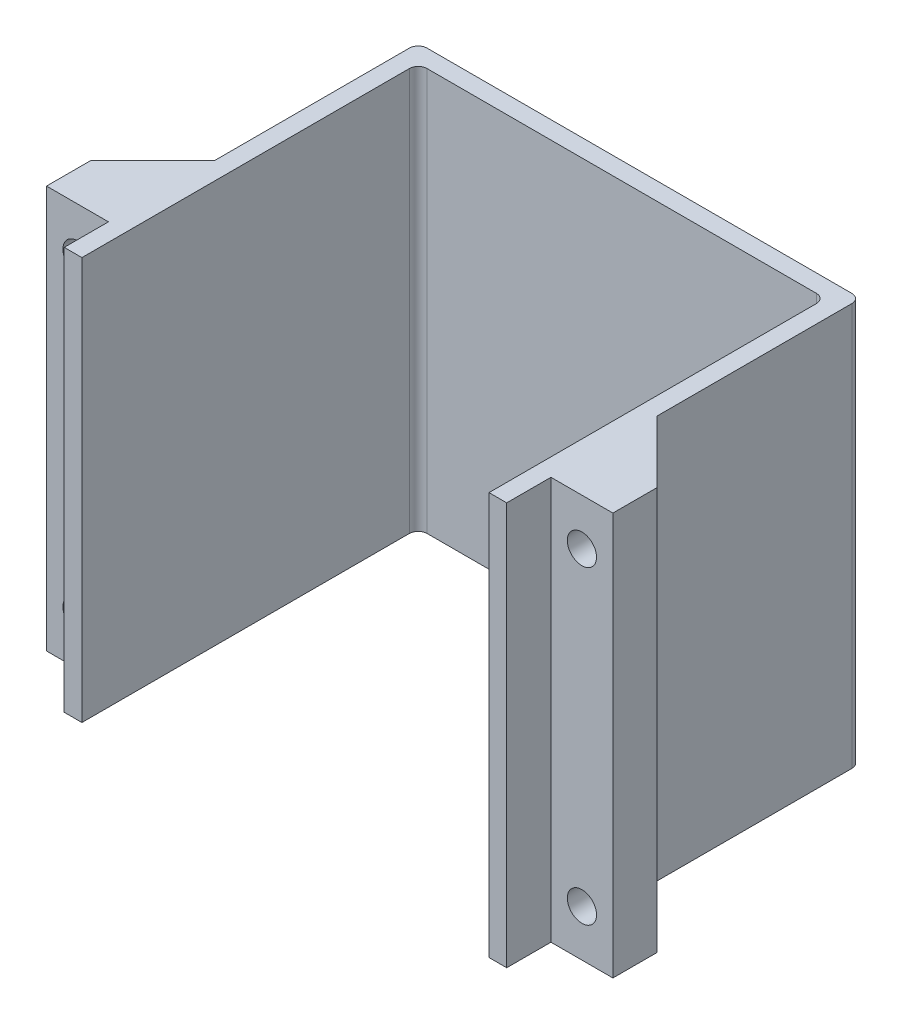
ISO-10303-21;
HEADER;
FILE_DESCRIPTION(('STEP AP214'),'2;1');
FILE_NAME('part.step','',(''),(''),'','','');
FILE_SCHEMA(('AUTOMOTIVE_DESIGN { 1 0 10303 214 1 1 1 1 }'));
ENDSEC;
DATA;
#1=APPLICATION_CONTEXT('core data for automotive mechanical design processes');
#2=APPLICATION_PROTOCOL_DEFINITION('international standard','automotive_design',2000,#1);
#3=PRODUCT_CONTEXT('',#1,'mechanical');
#4=PRODUCT('Part','Part','',(#3));
#5=PRODUCT_RELATED_PRODUCT_CATEGORY('part','',(#4));
#6=PRODUCT_DEFINITION_FORMATION('','',#4);
#7=PRODUCT_DEFINITION_CONTEXT('part definition',#1,'design');
#8=PRODUCT_DEFINITION('design','',#6,#7);
#9=PRODUCT_DEFINITION_SHAPE('','',#8);
#10=(LENGTH_UNIT() NAMED_UNIT(*) SI_UNIT(.MILLI.,.METRE.));
#11=(NAMED_UNIT(*) PLANE_ANGLE_UNIT() SI_UNIT($,.RADIAN.));
#12=(NAMED_UNIT(*) SI_UNIT($,.STERADIAN.) SOLID_ANGLE_UNIT());
#13=UNCERTAINTY_MEASURE_WITH_UNIT(LENGTH_MEASURE(1.E-05),#10,'distance_accuracy_value','');
#14=(GEOMETRIC_REPRESENTATION_CONTEXT(3) GLOBAL_UNCERTAINTY_ASSIGNED_CONTEXT((#13)) GLOBAL_UNIT_ASSIGNED_CONTEXT((#10,
#11,#12)) REPRESENTATION_CONTEXT('',''));
#15=CARTESIAN_POINT('',(0.,0.,0.));
#16=DIRECTION('',(0.,0.,1.));
#17=DIRECTION('',(1.,0.,0.));
#18=AXIS2_PLACEMENT_3D('',#15,#16,#17);
#19=CARTESIAN_POINT('',(28.5,5.25,-20.001));
#20=DIRECTION('',(0.,0.,1.));
#21=DIRECTION('',(1.,0.,0.));
#22=AXIS2_PLACEMENT_3D('',#19,#20,#21);
#23=CYLINDRICAL_SURFACE('',#22,1.65);
#24=CARTESIAN_POINT('',(28.5,5.25,10.));
#25=DIRECTION('',(0.,0.,-1.));
#26=DIRECTION('',(-1.,0.,0.));
#27=AXIS2_PLACEMENT_3D('',#24,#25,#26);
#28=CIRCLE('',#27,1.65);
#29=CARTESIAN_POINT('',(26.85,5.25,10.));
#30=VERTEX_POINT('',#29);
#31=EDGE_CURVE('E247',#30,#30,#28,.F.);
#32=ORIENTED_EDGE('',*,*,#31,.F.);
#33=EDGE_LOOP('',(#32));
#34=FACE_BOUND('',#33,.T.);
#35=CARTESIAN_POINT('',(28.5,5.25,15.));
#36=DIRECTION('',(0.,0.,1.));
#37=DIRECTION('',(1.,0.,0.));
#38=AXIS2_PLACEMENT_3D('',#35,#36,#37);
#39=CIRCLE('',#38,1.65);
#40=CARTESIAN_POINT('',(30.15,5.25,15.));
#41=VERTEX_POINT('',#40);
#42=EDGE_CURVE('E739',#41,#41,#39,.F.);
#43=ORIENTED_EDGE('',*,*,#42,.F.);
#44=EDGE_LOOP('',(#43));
#45=FACE_BOUND('',#44,.T.);
#46=ADVANCED_FACE('F37',(#34,#45),#23,.F.);
#47=CARTESIAN_POINT('',(28.5,40.25,-20.001));
#48=DIRECTION('',(0.,0.,1.));
#49=DIRECTION('',(1.,0.,0.));
#50=AXIS2_PLACEMENT_3D('',#47,#48,#49);
#51=CYLINDRICAL_SURFACE('',#50,1.65);
#52=CARTESIAN_POINT('',(28.5,40.25,10.));
#53=DIRECTION('',(0.,0.,-1.));
#54=DIRECTION('',(-1.,0.,0.));
#55=AXIS2_PLACEMENT_3D('',#52,#53,#54);
#56=CIRCLE('',#55,1.65);
#57=CARTESIAN_POINT('',(26.85,40.25,10.));
#58=VERTEX_POINT('',#57);
#59=EDGE_CURVE('E244',#58,#58,#56,.F.);
#60=ORIENTED_EDGE('',*,*,#59,.F.);
#61=EDGE_LOOP('',(#60));
#62=FACE_BOUND('',#61,.T.);
#63=CARTESIAN_POINT('',(28.5,40.25,15.));
#64=DIRECTION('',(0.,0.,1.));
#65=DIRECTION('',(1.,0.,0.));
#66=AXIS2_PLACEMENT_3D('',#63,#64,#65);
#67=CIRCLE('',#66,1.65);
#68=CARTESIAN_POINT('',(30.15,40.25,15.));
#69=VERTEX_POINT('',#68);
#70=EDGE_CURVE('E736',#69,#69,#67,.F.);
#71=ORIENTED_EDGE('',*,*,#70,.F.);
#72=EDGE_LOOP('',(#71));
#73=FACE_BOUND('',#72,.T.);
#74=ADVANCED_FACE('F429',(#62,#73),#51,.F.);
#75=CARTESIAN_POINT('',(32.,45.5,-20.));
#76=DIRECTION('',(-1.,0.,0.));
#77=DIRECTION('',(0.,0.,1.));
#78=AXIS2_PLACEMENT_3D('',#75,#76,#77);
#79=PLANE('',#78);
#80=DIRECTION('',(0.,-1.,0.));
#81=VECTOR('',#80,1.);
#82=CARTESIAN_POINT('',(32.,45.5,15.));
#83=LINE('',#82,#81);
#84=CARTESIAN_POINT('',(32.,45.5,15.));
#85=VERTEX_POINT('',#84);
#86=CARTESIAN_POINT('',(32.,0.,15.));
#87=VERTEX_POINT('',#86);
#88=EDGE_CURVE('E175',#85,#87,#83,.T.);
#89=ORIENTED_EDGE('',*,*,#88,.T.);
#90=DIRECTION('',(0.,0.,-1.));
#91=VECTOR('',#90,1.);
#92=CARTESIAN_POINT('',(32.,0.,-20.));
#93=LINE('',#92,#91);
#94=CARTESIAN_POINT('',(32.,0.,10.));
#95=VERTEX_POINT('',#94);
#96=EDGE_CURVE('E221',#87,#95,#93,.T.);
#97=ORIENTED_EDGE('',*,*,#96,.T.);
#98=DIRECTION('',(0.,1.,0.));
#99=VECTOR('',#98,1.);
#100=CARTESIAN_POINT('',(32.,-0.001000000000001,10.));
#101=LINE('',#100,#99);
#102=CARTESIAN_POINT('',(32.,45.5,10.));
#103=VERTEX_POINT('',#102);
#104=EDGE_CURVE('E201',#95,#103,#101,.T.);
#105=ORIENTED_EDGE('',*,*,#104,.T.);
#106=DIRECTION('',(0.,0.,-1.));
#107=VECTOR('',#106,1.);
#108=CARTESIAN_POINT('',(32.,45.5,-20.));
#109=LINE('',#108,#107);
#110=EDGE_CURVE('E193',#85,#103,#109,.T.);
#111=ORIENTED_EDGE('',*,*,#110,.F.);
#112=EDGE_LOOP('',(#89,#97,#105,#111));
#113=FACE_BOUND('',#112,.T.);
#114=ADVANCED_FACE('F199',(#113),#79,.F.);
#115=CARTESIAN_POINT('',(0.,45.5,0.));
#116=DIRECTION('',(0.,1.,0.));
#117=DIRECTION('',(0.,0.,1.));
#118=AXIS2_PLACEMENT_3D('',#115,#116,#117);
#119=PLANE('',#118);
#120=DIRECTION('',(-1.,0.,0.));
#121=VECTOR('',#120,1.);
#122=CARTESIAN_POINT('',(-32.,45.5,-20.));
#123=LINE('',#122,#121);
#124=CARTESIAN_POINT('',(24.,45.5,-20.));
#125=VERTEX_POINT('',#124);
#126=CARTESIAN_POINT('',(-24.,45.5,-20.));
#127=VERTEX_POINT('',#126);
#128=EDGE_CURVE('E203',#125,#127,#123,.T.);
#129=ORIENTED_EDGE('',*,*,#128,.T.);
#130=CARTESIAN_POINT('',(-24.,45.5,-19.));
#131=DIRECTION('',(0.,1.,0.));
#132=DIRECTION('',(0.,0.,1.));
#133=AXIS2_PLACEMENT_3D('',#130,#131,#132);
#134=CIRCLE('',#133,1.);
#135=CARTESIAN_POINT('',(-25.,45.5,-19.));
#136=VERTEX_POINT('',#135);
#137=EDGE_CURVE('E264',#127,#136,#134,.T.);
#138=ORIENTED_EDGE('',*,*,#137,.T.);
#139=DIRECTION('',(0.,0.,-1.));
#140=VECTOR('',#139,1.);
#141=CARTESIAN_POINT('',(-25.,45.5,-20.));
#142=LINE('',#141,#140);
#143=CARTESIAN_POINT('',(-25.,45.5,3.00000000000006));
#144=VERTEX_POINT('',#143);
#145=EDGE_CURVE('E368',#144,#136,#142,.T.);
#146=ORIENTED_EDGE('',*,*,#145,.F.);
#147=DIRECTION('',(-0.707106781186551,0.,0.707106781186544));
#148=VECTOR('',#147,1.);
#149=CARTESIAN_POINT('',(-25.,45.5,3.00000000000006));
#150=LINE('',#149,#148);
#151=CARTESIAN_POINT('',(-32.,45.5,10.));
#152=VERTEX_POINT('',#151);
#153=EDGE_CURVE('E361',#144,#152,#150,.T.);
#154=ORIENTED_EDGE('',*,*,#153,.T.);
#155=DIRECTION('',(0.,0.,1.));
#156=VECTOR('',#155,1.);
#157=CARTESIAN_POINT('',(-32.,45.5,-20.));
#158=LINE('',#157,#156);
#159=CARTESIAN_POINT('',(-32.,45.5,15.));
#160=VERTEX_POINT('',#159);
#161=EDGE_CURVE('E206',#152,#160,#158,.T.);
#162=ORIENTED_EDGE('',*,*,#161,.T.);
#163=DIRECTION('',(-1.,0.,0.));
#164=VECTOR('',#163,1.);
#165=CARTESIAN_POINT('',(-32.,45.5,15.));
#166=LINE('',#165,#164);
#167=CARTESIAN_POINT('',(-25.,45.5,15.));
#168=VERTEX_POINT('',#167);
#169=EDGE_CURVE('E339',#168,#160,#166,.T.);
#170=ORIENTED_EDGE('',*,*,#169,.F.);
#171=DIRECTION('',(0.,0.,1.));
#172=VECTOR('',#171,1.);
#173=CARTESIAN_POINT('',(-25.,45.5,15.));
#174=LINE('',#173,#172);
#175=CARTESIAN_POINT('',(-25.,45.5,20.));
#176=VERTEX_POINT('',#175);
#177=EDGE_CURVE('E338',#168,#176,#174,.T.);
#178=ORIENTED_EDGE('',*,*,#177,.T.);
#179=DIRECTION('',(1.,0.,0.));
#180=VECTOR('',#179,1.);
#181=CARTESIAN_POINT('',(-32.,45.5,20.));
#182=LINE('',#181,#180);
#183=CARTESIAN_POINT('',(-23.,45.5,20.));
#184=VERTEX_POINT('',#183);
#185=EDGE_CURVE('E217',#176,#184,#182,.T.);
#186=ORIENTED_EDGE('',*,*,#185,.T.);
#187=DIRECTION('',(0.,0.,1.));
#188=VECTOR('',#187,1.);
#189=CARTESIAN_POINT('',(-23.,45.5,-18.));
#190=LINE('',#189,#188);
#191=CARTESIAN_POINT('',(-23.,45.5,-17.));
#192=VERTEX_POINT('',#191);
#193=EDGE_CURVE('E300',#192,#184,#190,.T.);
#194=ORIENTED_EDGE('',*,*,#193,.F.);
#195=CARTESIAN_POINT('',(-22.,45.5,-17.));
#196=DIRECTION('',(0.,1.,0.));
#197=DIRECTION('',(0.,0.,1.));
#198=AXIS2_PLACEMENT_3D('',#195,#196,#197);
#199=CIRCLE('',#198,1.);
#200=CARTESIAN_POINT('',(-22.,45.5,-18.));
#201=VERTEX_POINT('',#200);
#202=EDGE_CURVE('E284',#192,#201,#199,.F.);
#203=ORIENTED_EDGE('',*,*,#202,.T.);
#204=DIRECTION('',(-1.,0.,0.));
#205=VECTOR('',#204,1.);
#206=CARTESIAN_POINT('',(23.,45.5,-18.));
#207=LINE('',#206,#205);
#208=CARTESIAN_POINT('',(22.,45.5,-18.));
#209=VERTEX_POINT('',#208);
#210=EDGE_CURVE('E292',#209,#201,#207,.T.);
#211=ORIENTED_EDGE('',*,*,#210,.F.);
#212=CARTESIAN_POINT('',(22.,45.5,-17.));
#213=DIRECTION('',(0.,1.,0.));
#214=DIRECTION('',(0.,0.,1.));
#215=AXIS2_PLACEMENT_3D('',#212,#213,#214);
#216=CIRCLE('',#215,1.);
#217=CARTESIAN_POINT('',(23.,45.5,-17.));
#218=VERTEX_POINT('',#217);
#219=EDGE_CURVE('E45',#209,#218,#216,.F.);
#220=ORIENTED_EDGE('',*,*,#219,.T.);
#221=DIRECTION('',(0.,0.,-1.));
#222=VECTOR('',#221,1.);
#223=CARTESIAN_POINT('',(23.,45.5,-18.));
#224=LINE('',#223,#222);
#225=CARTESIAN_POINT('',(23.,45.5,20.));
#226=VERTEX_POINT('',#225);
#227=EDGE_CURVE('E289',#226,#218,#224,.T.);
#228=ORIENTED_EDGE('',*,*,#227,.F.);
#229=CARTESIAN_POINT('',(25.,45.5,20.));
#230=VERTEX_POINT('',#229);
#231=EDGE_CURVE('E216',#226,#230,#182,.T.);
#232=ORIENTED_EDGE('',*,*,#231,.T.);
#233=DIRECTION('',(0.,0.,1.));
#234=VECTOR('',#233,1.);
#235=CARTESIAN_POINT('',(25.,45.5,15.));
#236=LINE('',#235,#234);
#237=CARTESIAN_POINT('',(25.,45.5,15.));
#238=VERTEX_POINT('',#237);
#239=EDGE_CURVE('E196',#238,#230,#236,.T.);
#240=ORIENTED_EDGE('',*,*,#239,.F.);
#241=DIRECTION('',(1.,0.,0.));
#242=VECTOR('',#241,1.);
#243=CARTESIAN_POINT('',(32.,45.5,15.));
#244=LINE('',#243,#242);
#245=EDGE_CURVE('E180',#238,#85,#244,.T.);
#246=ORIENTED_EDGE('',*,*,#245,.T.);
#247=ORIENTED_EDGE('',*,*,#110,.T.);
#248=DIRECTION('',(0.707106781186551,0.,0.707106781186544));
#249=VECTOR('',#248,1.);
#250=CARTESIAN_POINT('',(25.,45.5,3.00000000000006));
#251=LINE('',#250,#249);
#252=CARTESIAN_POINT('',(25.,45.5,3.00000000000006));
#253=VERTEX_POINT('',#252);
#254=EDGE_CURVE('E398',#253,#103,#251,.T.);
#255=ORIENTED_EDGE('',*,*,#254,.F.);
#256=DIRECTION('',(0.,0.,-1.));
#257=VECTOR('',#256,1.);
#258=CARTESIAN_POINT('',(25.,45.5,-20.));
#259=LINE('',#258,#257);
#260=CARTESIAN_POINT('',(25.,45.5,-19.));
#261=VERTEX_POINT('',#260);
#262=EDGE_CURVE('E396',#253,#261,#259,.T.);
#263=ORIENTED_EDGE('',*,*,#262,.T.);
#264=CARTESIAN_POINT('',(24.,45.5,-19.));
#265=DIRECTION('',(0.,1.,0.));
#266=DIRECTION('',(0.,0.,1.));
#267=AXIS2_PLACEMENT_3D('',#264,#265,#266);
#268=CIRCLE('',#267,1.);
#269=EDGE_CURVE('E262',#261,#125,#268,.T.);
#270=ORIENTED_EDGE('',*,*,#269,.T.);
#271=EDGE_LOOP('',(#129,#138,#146,#154,#162,#170,#178,#186,#194,#203,#211,#220,#228,#232,#240,
#246,#247,#255,#263,#270));
#272=FACE_BOUND('',#271,.T.);
#273=ADVANCED_FACE('F191',(#272),#119,.T.);
#274=CARTESIAN_POINT('',(0.,0.,0.));
#275=DIRECTION('',(0.,1.,0.));
#276=DIRECTION('',(0.,0.,1.));
#277=AXIS2_PLACEMENT_3D('',#274,#275,#276);
#278=PLANE('',#277);
#279=DIRECTION('',(0.,0.,1.));
#280=VECTOR('',#279,1.);
#281=CARTESIAN_POINT('',(-25.,0.,-20.));
#282=LINE('',#281,#280);
#283=CARTESIAN_POINT('',(-25.,0.,-19.));
#284=VERTEX_POINT('',#283);
#285=CARTESIAN_POINT('',(-25.,0.,3.00000000000006));
#286=VERTEX_POINT('',#285);
#287=EDGE_CURVE('E364',#284,#286,#282,.T.);
#288=ORIENTED_EDGE('',*,*,#287,.F.);
#289=CARTESIAN_POINT('',(-24.,0.,-19.));
#290=DIRECTION('',(0.,1.,0.));
#291=DIRECTION('',(0.,0.,1.));
#292=AXIS2_PLACEMENT_3D('',#289,#290,#291);
#293=CIRCLE('',#292,1.);
#294=CARTESIAN_POINT('',(-24.,0.,-20.));
#295=VERTEX_POINT('',#294);
#296=EDGE_CURVE('E269',#284,#295,#293,.F.);
#297=ORIENTED_EDGE('',*,*,#296,.T.);
#298=DIRECTION('',(-1.,0.,0.));
#299=VECTOR('',#298,1.);
#300=CARTESIAN_POINT('',(-32.,0.,-20.));
#301=LINE('',#300,#299);
#302=CARTESIAN_POINT('',(24.,0.,-20.));
#303=VERTEX_POINT('',#302);
#304=EDGE_CURVE('E223',#303,#295,#301,.T.);
#305=ORIENTED_EDGE('',*,*,#304,.F.);
#306=CARTESIAN_POINT('',(24.,0.,-19.));
#307=DIRECTION('',(0.,1.,0.));
#308=DIRECTION('',(0.,0.,1.));
#309=AXIS2_PLACEMENT_3D('',#306,#307,#308);
#310=CIRCLE('',#309,1.);
#311=CARTESIAN_POINT('',(25.,0.,-19.));
#312=VERTEX_POINT('',#311);
#313=EDGE_CURVE('E52',#303,#312,#310,.F.);
#314=ORIENTED_EDGE('',*,*,#313,.T.);
#315=DIRECTION('',(0.,0.,1.));
#316=VECTOR('',#315,1.);
#317=CARTESIAN_POINT('',(25.,0.,-20.));
#318=LINE('',#317,#316);
#319=CARTESIAN_POINT('',(25.,0.,3.00000000000006));
#320=VERTEX_POINT('',#319);
#321=EDGE_CURVE('E397',#312,#320,#318,.T.);
#322=ORIENTED_EDGE('',*,*,#321,.T.);
#323=DIRECTION('',(0.707106781186551,0.,0.707106781186544));
#324=VECTOR('',#323,1.);
#325=CARTESIAN_POINT('',(25.,0.,3.00000000000006));
#326=LINE('',#325,#324);
#327=EDGE_CURVE('E257',#320,#95,#326,.T.);
#328=ORIENTED_EDGE('',*,*,#327,.T.);
#329=ORIENTED_EDGE('',*,*,#96,.F.);
#330=DIRECTION('',(-1.,0.,0.));
#331=VECTOR('',#330,1.);
#332=CARTESIAN_POINT('',(32.,0.,15.));
#333=LINE('',#332,#331);
#334=CARTESIAN_POINT('',(25.,0.,15.));
#335=VERTEX_POINT('',#334);
#336=EDGE_CURVE('E183',#87,#335,#333,.T.);
#337=ORIENTED_EDGE('',*,*,#336,.T.);
#338=DIRECTION('',(0.,0.,1.));
#339=VECTOR('',#338,1.);
#340=CARTESIAN_POINT('',(25.,0.,15.));
#341=LINE('',#340,#339);
#342=CARTESIAN_POINT('',(25.,0.,20.));
#343=VERTEX_POINT('',#342);
#344=EDGE_CURVE('E733',#335,#343,#341,.T.);
#345=ORIENTED_EDGE('',*,*,#344,.T.);
#346=DIRECTION('',(1.,0.,0.));
#347=VECTOR('',#346,1.);
#348=CARTESIAN_POINT('',(-32.,0.,20.));
#349=LINE('',#348,#347);
#350=CARTESIAN_POINT('',(23.,0.,20.));
#351=VERTEX_POINT('',#350);
#352=EDGE_CURVE('E208',#351,#343,#349,.T.);
#353=ORIENTED_EDGE('',*,*,#352,.F.);
#354=DIRECTION('',(0.,0.,1.));
#355=VECTOR('',#354,1.);
#356=CARTESIAN_POINT('',(23.,0.,-18.));
#357=LINE('',#356,#355);
#358=CARTESIAN_POINT('',(23.,0.,-17.));
#359=VERTEX_POINT('',#358);
#360=EDGE_CURVE('E308',#359,#351,#357,.T.);
#361=ORIENTED_EDGE('',*,*,#360,.F.);
#362=CARTESIAN_POINT('',(22.,0.,-17.));
#363=DIRECTION('',(0.,1.,0.));
#364=DIRECTION('',(0.,0.,1.));
#365=AXIS2_PLACEMENT_3D('',#362,#363,#364);
#366=CIRCLE('',#365,1.);
#367=CARTESIAN_POINT('',(22.,0.,-18.));
#368=VERTEX_POINT('',#367);
#369=EDGE_CURVE('E12',#359,#368,#366,.T.);
#370=ORIENTED_EDGE('',*,*,#369,.T.);
#371=DIRECTION('',(1.,0.,0.));
#372=VECTOR('',#371,1.);
#373=CARTESIAN_POINT('',(23.,0.,-18.));
#374=LINE('',#373,#372);
#375=CARTESIAN_POINT('',(-22.,0.,-18.));
#376=VERTEX_POINT('',#375);
#377=EDGE_CURVE('E306',#376,#368,#374,.T.);
#378=ORIENTED_EDGE('',*,*,#377,.F.);
#379=CARTESIAN_POINT('',(-22.,0.,-17.));
#380=DIRECTION('',(0.,1.,0.));
#381=DIRECTION('',(0.,0.,1.));
#382=AXIS2_PLACEMENT_3D('',#379,#380,#381);
#383=CIRCLE('',#382,1.);
#384=CARTESIAN_POINT('',(-23.,0.,-17.));
#385=VERTEX_POINT('',#384);
#386=EDGE_CURVE('E59',#376,#385,#383,.T.);
#387=ORIENTED_EDGE('',*,*,#386,.T.);
#388=DIRECTION('',(0.,0.,-1.));
#389=VECTOR('',#388,1.);
#390=CARTESIAN_POINT('',(-23.,0.,-18.));
#391=LINE('',#390,#389);
#392=CARTESIAN_POINT('',(-23.,0.,20.));
#393=VERTEX_POINT('',#392);
#394=EDGE_CURVE('E312',#393,#385,#391,.T.);
#395=ORIENTED_EDGE('',*,*,#394,.F.);
#396=CARTESIAN_POINT('',(-25.,0.,20.));
#397=VERTEX_POINT('',#396);
#398=EDGE_CURVE('E204',#397,#393,#349,.T.);
#399=ORIENTED_EDGE('',*,*,#398,.F.);
#400=DIRECTION('',(0.,0.,1.));
#401=VECTOR('',#400,1.);
#402=CARTESIAN_POINT('',(-25.,0.,15.));
#403=LINE('',#402,#401);
#404=CARTESIAN_POINT('',(-25.,0.,15.));
#405=VERTEX_POINT('',#404);
#406=EDGE_CURVE('E333',#405,#397,#403,.T.);
#407=ORIENTED_EDGE('',*,*,#406,.F.);
#408=DIRECTION('',(1.,0.,0.));
#409=VECTOR('',#408,1.);
#410=CARTESIAN_POINT('',(-32.,0.,15.));
#411=LINE('',#410,#409);
#412=CARTESIAN_POINT('',(-32.,0.,15.));
#413=VERTEX_POINT('',#412);
#414=EDGE_CURVE('E336',#413,#405,#411,.T.);
#415=ORIENTED_EDGE('',*,*,#414,.F.);
#416=DIRECTION('',(0.,0.,1.));
#417=VECTOR('',#416,1.);
#418=CARTESIAN_POINT('',(-32.,0.,-20.));
#419=LINE('',#418,#417);
#420=CARTESIAN_POINT('',(-32.,0.,10.));
#421=VERTEX_POINT('',#420);
#422=EDGE_CURVE('E227',#421,#413,#419,.T.);
#423=ORIENTED_EDGE('',*,*,#422,.F.);
#424=DIRECTION('',(-0.707106781186551,0.,0.707106781186544));
#425=VECTOR('',#424,1.);
#426=CARTESIAN_POINT('',(-25.,0.,3.00000000000006));
#427=LINE('',#426,#425);
#428=EDGE_CURVE('E358',#286,#421,#427,.T.);
#429=ORIENTED_EDGE('',*,*,#428,.F.);
#430=EDGE_LOOP('',(#288,#297,#305,#314,#322,#328,#329,#337,#345,#353,#361,#370,#378,#387,#395,
#399,#407,#415,#423,#429));
#431=FACE_BOUND('',#430,.T.);
#432=ADVANCED_FACE('F305',(#431),#278,.F.);
#433=CARTESIAN_POINT('',(-32.,45.5,20.));
#434=DIRECTION('',(0.,0.,-1.));
#435=DIRECTION('',(-1.,0.,0.));
#436=AXIS2_PLACEMENT_3D('',#433,#434,#435);
#437=PLANE('',#436);
#438=DIRECTION('',(0.,1.,0.));
#439=VECTOR('',#438,1.);
#440=CARTESIAN_POINT('',(25.,45.5,20.));
#441=LINE('',#440,#439);
#442=EDGE_CURVE('E187',#343,#230,#441,.T.);
#443=ORIENTED_EDGE('',*,*,#442,.T.);
#444=ORIENTED_EDGE('',*,*,#231,.F.);
#445=DIRECTION('',(0.,1.,0.));
#446=VECTOR('',#445,1.);
#447=CARTESIAN_POINT('',(23.,-0.001000000000001,20.));
#448=LINE('',#447,#446);
#449=EDGE_CURVE('E224',#351,#226,#448,.T.);
#450=ORIENTED_EDGE('',*,*,#449,.F.);
#451=ORIENTED_EDGE('',*,*,#352,.T.);
#452=EDGE_LOOP('',(#443,#444,#450,#451));
#453=FACE_BOUND('',#452,.T.);
#454=ADVANCED_FACE('F484',(#453),#437,.F.);
#455=CARTESIAN_POINT('',(-32.,45.5,-20.));
#456=DIRECTION('',(0.,0.,1.));
#457=DIRECTION('',(1.,0.,0.));
#458=AXIS2_PLACEMENT_3D('',#455,#456,#457);
#459=PLANE('',#458);
#460=ORIENTED_EDGE('',*,*,#304,.T.);
#461=DIRECTION('',(0.,1.,0.));
#462=VECTOR('',#461,1.);
#463=CARTESIAN_POINT('',(-24.,45.5,-20.));
#464=LINE('',#463,#462);
#465=EDGE_CURVE('E259',#295,#127,#464,.T.);
#466=ORIENTED_EDGE('',*,*,#465,.T.);
#467=ORIENTED_EDGE('',*,*,#128,.F.);
#468=DIRECTION('',(0.,1.,0.));
#469=VECTOR('',#468,1.);
#470=CARTESIAN_POINT('',(24.,0.,-20.));
#471=LINE('',#470,#469);
#472=EDGE_CURVE('E220',#125,#303,#471,.F.);
#473=ORIENTED_EDGE('',*,*,#472,.T.);
#474=EDGE_LOOP('',(#460,#466,#467,#473));
#475=FACE_BOUND('',#474,.T.);
#476=ADVANCED_FACE('F386',(#475),#459,.F.);
#477=CARTESIAN_POINT('',(-28.5,5.25,-20.001));
#478=DIRECTION('',(0.,0.,1.));
#479=DIRECTION('',(1.,0.,0.));
#480=AXIS2_PLACEMENT_3D('',#477,#478,#479);
#481=CYLINDRICAL_SURFACE('',#480,1.65);
#482=CARTESIAN_POINT('',(-28.5,5.25,10.));
#483=DIRECTION('',(0.,0.,-1.));
#484=DIRECTION('',(-1.,0.,0.));
#485=AXIS2_PLACEMENT_3D('',#482,#483,#484);
#486=CIRCLE('',#485,1.65);
#487=CARTESIAN_POINT('',(-30.15,5.25,10.));
#488=VERTEX_POINT('',#487);
#489=EDGE_CURVE('E233',#488,#488,#486,.T.);
#490=ORIENTED_EDGE('',*,*,#489,.T.);
#491=EDGE_LOOP('',(#490));
#492=FACE_BOUND('',#491,.T.);
#493=CARTESIAN_POINT('',(-28.5,5.25,15.));
#494=DIRECTION('',(0.,0.,1.));
#495=DIRECTION('',(1.,0.,0.));
#496=AXIS2_PLACEMENT_3D('',#493,#494,#495);
#497=CIRCLE('',#496,1.65);
#498=CARTESIAN_POINT('',(-26.85,5.25,15.));
#499=VERTEX_POINT('',#498);
#500=EDGE_CURVE('E350',#499,#499,#497,.T.);
#501=ORIENTED_EDGE('',*,*,#500,.T.);
#502=EDGE_LOOP('',(#501));
#503=FACE_BOUND('',#502,.T.);
#504=ADVANCED_FACE('F423',(#492,#503),#481,.F.);
#505=CARTESIAN_POINT('',(-28.5,40.25,-20.001));
#506=DIRECTION('',(0.,0.,1.));
#507=DIRECTION('',(1.,0.,0.));
#508=AXIS2_PLACEMENT_3D('',#505,#506,#507);
#509=CYLINDRICAL_SURFACE('',#508,1.65);
#510=CARTESIAN_POINT('',(-28.5,40.25,10.));
#511=DIRECTION('',(0.,0.,-1.));
#512=DIRECTION('',(-1.,0.,0.));
#513=AXIS2_PLACEMENT_3D('',#510,#511,#512);
#514=CIRCLE('',#513,1.65);
#515=CARTESIAN_POINT('',(-30.15,40.25,10.));
#516=VERTEX_POINT('',#515);
#517=EDGE_CURVE('E230',#516,#516,#514,.T.);
#518=ORIENTED_EDGE('',*,*,#517,.T.);
#519=EDGE_LOOP('',(#518));
#520=FACE_BOUND('',#519,.T.);
#521=CARTESIAN_POINT('',(-28.5,40.25,15.));
#522=DIRECTION('',(0.,0.,1.));
#523=DIRECTION('',(1.,0.,0.));
#524=AXIS2_PLACEMENT_3D('',#521,#522,#523);
#525=CIRCLE('',#524,1.65);
#526=CARTESIAN_POINT('',(-26.85,40.25,15.));
#527=VERTEX_POINT('',#526);
#528=EDGE_CURVE('E342',#527,#527,#525,.T.);
#529=ORIENTED_EDGE('',*,*,#528,.T.);
#530=EDGE_LOOP('',(#529));
#531=FACE_BOUND('',#530,.T.);
#532=ADVANCED_FACE('F416',(#520,#531),#509,.F.);
#533=CARTESIAN_POINT('',(-32.,45.5,-20.));
#534=DIRECTION('',(1.,0.,0.));
#535=DIRECTION('',(0.,0.,-1.));
#536=AXIS2_PLACEMENT_3D('',#533,#534,#535);
#537=PLANE('',#536);
#538=DIRECTION('',(0.,-1.,0.));
#539=VECTOR('',#538,1.);
#540=CARTESIAN_POINT('',(-32.,45.5,15.));
#541=LINE('',#540,#539);
#542=EDGE_CURVE('E406',#160,#413,#541,.T.);
#543=ORIENTED_EDGE('',*,*,#542,.F.);
#544=ORIENTED_EDGE('',*,*,#161,.F.);
#545=DIRECTION('',(0.,1.,0.));
#546=VECTOR('',#545,1.);
#547=CARTESIAN_POINT('',(-32.,-0.001000000000001,10.));
#548=LINE('',#547,#546);
#549=EDGE_CURVE('E315',#421,#152,#548,.T.);
#550=ORIENTED_EDGE('',*,*,#549,.F.);
#551=ORIENTED_EDGE('',*,*,#422,.T.);
#552=EDGE_LOOP('',(#543,#544,#550,#551));
#553=FACE_BOUND('',#552,.T.);
#554=ADVANCED_FACE('F414',(#553),#537,.F.);
#555=CARTESIAN_POINT('',(-25.,-0.001000000000001,-20.));
#556=DIRECTION('',(1.,0.,0.));
#557=DIRECTION('',(0.,0.,-1.));
#558=AXIS2_PLACEMENT_3D('',#555,#556,#557);
#559=PLANE('',#558);
#560=ORIENTED_EDGE('',*,*,#145,.T.);
#561=DIRECTION('',(0.,1.,0.));
#562=VECTOR('',#561,1.);
#563=CARTESIAN_POINT('',(-25.,-0.001000000000001,-19.));
#564=LINE('',#563,#562);
#565=EDGE_CURVE('E266',#136,#284,#564,.F.);
#566=ORIENTED_EDGE('',*,*,#565,.T.);
#567=ORIENTED_EDGE('',*,*,#287,.T.);
#568=DIRECTION('',(0.,-1.,0.));
#569=VECTOR('',#568,1.);
#570=CARTESIAN_POINT('',(-25.,55.3994949366116,3.00000000000006));
#571=LINE('',#570,#569);
#572=EDGE_CURVE('E243',#144,#286,#571,.T.);
#573=ORIENTED_EDGE('',*,*,#572,.F.);
#574=EDGE_LOOP('',(#560,#566,#567,#573));
#575=FACE_BOUND('',#574,.T.);
#576=ADVANCED_FACE('F380',(#575),#559,.F.);
#577=ORIENTED_EDGE('',*,*,#185,.F.);
#578=DIRECTION('',(0.,1.,0.));
#579=VECTOR('',#578,1.);
#580=CARTESIAN_POINT('',(-25.,45.5,20.));
#581=LINE('',#580,#579);
#582=EDGE_CURVE('E401',#397,#176,#581,.T.);
#583=ORIENTED_EDGE('',*,*,#582,.F.);
#584=ORIENTED_EDGE('',*,*,#398,.T.);
#585=DIRECTION('',(0.,1.,0.));
#586=VECTOR('',#585,1.);
#587=CARTESIAN_POINT('',(-23.,-0.001000000000001,20.));
#588=LINE('',#587,#586);
#589=EDGE_CURVE('E211',#393,#184,#588,.T.);
#590=ORIENTED_EDGE('',*,*,#589,.T.);
#591=EDGE_LOOP('',(#577,#583,#584,#590));
#592=FACE_BOUND('',#591,.T.);
#593=ADVANCED_FACE('F324',(#592),#437,.F.);
#594=CARTESIAN_POINT('',(-23.,-0.001000000000001,-18.));
#595=DIRECTION('',(-1.,0.,0.));
#596=DIRECTION('',(0.,0.,1.));
#597=AXIS2_PLACEMENT_3D('',#594,#595,#596);
#598=PLANE('',#597);
#599=ORIENTED_EDGE('',*,*,#394,.T.);
#600=DIRECTION('',(0.,1.,0.));
#601=VECTOR('',#600,1.);
#602=CARTESIAN_POINT('',(-23.,45.5,-17.));
#603=LINE('',#602,#601);
#604=EDGE_CURVE('E271',#385,#192,#603,.T.);
#605=ORIENTED_EDGE('',*,*,#604,.T.);
#606=ORIENTED_EDGE('',*,*,#193,.T.);
#607=ORIENTED_EDGE('',*,*,#589,.F.);
#608=EDGE_LOOP('',(#599,#605,#606,#607));
#609=FACE_BOUND('',#608,.T.);
#610=ADVANCED_FACE('F328',(#609),#598,.F.);
#611=CARTESIAN_POINT('',(23.,-0.001000000000001,-18.));
#612=DIRECTION('',(0.,0.,-1.));
#613=DIRECTION('',(-1.,0.,0.));
#614=AXIS2_PLACEMENT_3D('',#611,#612,#613);
#615=PLANE('',#614);
#616=ORIENTED_EDGE('',*,*,#210,.T.);
#617=DIRECTION('',(0.,1.,0.));
#618=VECTOR('',#617,1.);
#619=CARTESIAN_POINT('',(-22.,0.,-18.));
#620=LINE('',#619,#618);
#621=EDGE_CURVE('E277',#201,#376,#620,.F.);
#622=ORIENTED_EDGE('',*,*,#621,.T.);
#623=ORIENTED_EDGE('',*,*,#377,.T.);
#624=DIRECTION('',(0.,1.,0.));
#625=VECTOR('',#624,1.);
#626=CARTESIAN_POINT('',(22.,45.5,-18.));
#627=LINE('',#626,#625);
#628=EDGE_CURVE('E274',#368,#209,#627,.T.);
#629=ORIENTED_EDGE('',*,*,#628,.T.);
#630=EDGE_LOOP('',(#616,#622,#623,#629));
#631=FACE_BOUND('',#630,.T.);
#632=ADVANCED_FACE('F310',(#631),#615,.F.);
#633=CARTESIAN_POINT('',(23.,-0.001000000000001,-18.));
#634=DIRECTION('',(1.,0.,0.));
#635=DIRECTION('',(0.,0.,-1.));
#636=AXIS2_PLACEMENT_3D('',#633,#634,#635);
#637=PLANE('',#636);
#638=ORIENTED_EDGE('',*,*,#227,.T.);
#639=DIRECTION('',(0.,1.,0.));
#640=VECTOR('',#639,1.);
#641=CARTESIAN_POINT('',(23.,0.,-17.));
#642=LINE('',#641,#640);
#643=EDGE_CURVE('E282',#218,#359,#642,.F.);
#644=ORIENTED_EDGE('',*,*,#643,.T.);
#645=ORIENTED_EDGE('',*,*,#360,.T.);
#646=ORIENTED_EDGE('',*,*,#449,.T.);
#647=EDGE_LOOP('',(#638,#644,#645,#646));
#648=FACE_BOUND('',#647,.T.);
#649=ADVANCED_FACE('F297',(#648),#637,.F.);
#650=CARTESIAN_POINT('',(-25.,55.3994949366116,3.00000000000006));
#651=DIRECTION('',(0.707106781186544,0.,0.707106781186551));
#652=DIRECTION('',(0.707106781186551,0.,-0.707106781186544));
#653=AXIS2_PLACEMENT_3D('',#650,#651,#652);
#654=PLANE('',#653);
#655=CARTESIAN_POINT('',(-28.5,40.25,6.50000000000003));
#656=DIRECTION('',(0.707106781186544,0.,0.707106781186551));
#657=DIRECTION('',(0.707106781186551,0.,-0.707106781186544));
#658=AXIS2_PLACEMENT_3D('',#655,#656,#657);
#659=ELLIPSE('',#658,4.24264068711927,3.);
#660=CARTESIAN_POINT('',(-25.5,40.25,3.50000000000006));
#661=VERTEX_POINT('',#660);
#662=EDGE_CURVE('E240',#661,#661,#659,.T.);
#663=ORIENTED_EDGE('',*,*,#662,.T.);
#664=EDGE_LOOP('',(#663));
#665=FACE_BOUND('',#664,.T.);
#666=CARTESIAN_POINT('',(-28.5,5.25,6.50000000000003));
#667=DIRECTION('',(0.707106781186544,0.,0.707106781186551));
#668=DIRECTION('',(0.707106781186551,0.,-0.707106781186544));
#669=AXIS2_PLACEMENT_3D('',#666,#667,#668);
#670=ELLIPSE('',#669,4.24264068711926,3.);
#671=CARTESIAN_POINT('',(-25.5,5.25,3.50000000000006));
#672=VERTEX_POINT('',#671);
#673=EDGE_CURVE('E237',#672,#672,#670,.T.);
#674=ORIENTED_EDGE('',*,*,#673,.T.);
#675=EDGE_LOOP('',(#674));
#676=FACE_BOUND('',#675,.T.);
#677=ORIENTED_EDGE('',*,*,#153,.F.);
#678=ORIENTED_EDGE('',*,*,#572,.T.);
#679=ORIENTED_EDGE('',*,*,#428,.T.);
#680=ORIENTED_EDGE('',*,*,#549,.T.);
#681=EDGE_LOOP('',(#677,#678,#679,#680));
#682=FACE_BOUND('',#681,.T.);
#683=ADVANCED_FACE('F373',(#665,#676,#682),#654,.F.);
#684=CARTESIAN_POINT('',(-28.5,40.25,28.4852813742386));
#685=DIRECTION('',(0.,0.,-1.));
#686=DIRECTION('',(-1.,0.,0.));
#687=AXIS2_PLACEMENT_3D('',#684,#685,#686);
#688=CYLINDRICAL_SURFACE('',#687,3.);
#689=CARTESIAN_POINT('',(-28.5,40.25,10.));
#690=DIRECTION('',(0.,0.,-1.));
#691=DIRECTION('',(-1.,0.,0.));
#692=AXIS2_PLACEMENT_3D('',#689,#690,#691);
#693=CIRCLE('',#692,3.);
#694=CARTESIAN_POINT('',(-31.5,40.25,10.));
#695=VERTEX_POINT('',#694);
#696=EDGE_CURVE('E234',#695,#695,#693,.F.);
#697=ORIENTED_EDGE('',*,*,#696,.T.);
#698=EDGE_LOOP('',(#697));
#699=FACE_BOUND('',#698,.T.);
#700=ORIENTED_EDGE('',*,*,#662,.F.);
#701=EDGE_LOOP('',(#700));
#702=FACE_BOUND('',#701,.T.);
#703=ADVANCED_FACE('F458',(#699,#702),#688,.F.);
#704=CARTESIAN_POINT('',(-32.,45.5,10.));
#705=DIRECTION('',(0.,0.,-1.));
#706=DIRECTION('',(-1.,0.,0.));
#707=AXIS2_PLACEMENT_3D('',#704,#705,#706);
#708=PLANE('',#707);
#709=ORIENTED_EDGE('',*,*,#517,.F.);
#710=EDGE_LOOP('',(#709));
#711=FACE_BOUND('',#710,.T.);
#712=ORIENTED_EDGE('',*,*,#696,.F.);
#713=EDGE_LOOP('',(#712));
#714=FACE_BOUND('',#713,.T.);
#715=ADVANCED_FACE('F454',(#711,#714),#708,.T.);
#716=CARTESIAN_POINT('',(-28.5,5.25,28.4852813742386));
#717=DIRECTION('',(0.,0.,-1.));
#718=DIRECTION('',(-1.,0.,0.));
#719=AXIS2_PLACEMENT_3D('',#716,#717,#718);
#720=CYLINDRICAL_SURFACE('',#719,3.);
#721=CARTESIAN_POINT('',(-28.5,5.25,10.));
#722=DIRECTION('',(0.,0.,-1.));
#723=DIRECTION('',(-1.,0.,0.));
#724=AXIS2_PLACEMENT_3D('',#721,#722,#723);
#725=CIRCLE('',#724,3.);
#726=CARTESIAN_POINT('',(-31.5,5.25,10.));
#727=VERTEX_POINT('',#726);
#728=EDGE_CURVE('E353',#727,#727,#725,.F.);
#729=ORIENTED_EDGE('',*,*,#728,.T.);
#730=EDGE_LOOP('',(#729));
#731=FACE_BOUND('',#730,.T.);
#732=ORIENTED_EDGE('',*,*,#673,.F.);
#733=EDGE_LOOP('',(#732));
#734=FACE_BOUND('',#733,.T.);
#735=ADVANCED_FACE('F457',(#731,#734),#720,.F.);
#736=CARTESIAN_POINT('',(-32.,45.5,10.));
#737=DIRECTION('',(0.,0.,-1.));
#738=DIRECTION('',(-1.,0.,0.));
#739=AXIS2_PLACEMENT_3D('',#736,#737,#738);
#740=PLANE('',#739);
#741=ORIENTED_EDGE('',*,*,#489,.F.);
#742=EDGE_LOOP('',(#741));
#743=FACE_BOUND('',#742,.T.);
#744=ORIENTED_EDGE('',*,*,#728,.F.);
#745=EDGE_LOOP('',(#744));
#746=FACE_BOUND('',#745,.T.);
#747=ADVANCED_FACE('F453',(#743,#746),#740,.T.);
#748=CARTESIAN_POINT('',(-25.,45.5,15.));
#749=DIRECTION('',(1.,0.,0.));
#750=DIRECTION('',(0.,0.,-1.));
#751=AXIS2_PLACEMENT_3D('',#748,#749,#750);
#752=PLANE('',#751);
#753=ORIENTED_EDGE('',*,*,#582,.T.);
#754=ORIENTED_EDGE('',*,*,#177,.F.);
#755=DIRECTION('',(0.,1.,0.));
#756=VECTOR('',#755,1.);
#757=CARTESIAN_POINT('',(-25.,45.5,15.));
#758=LINE('',#757,#756);
#759=EDGE_CURVE('E344',#405,#168,#758,.T.);
#760=ORIENTED_EDGE('',*,*,#759,.F.);
#761=ORIENTED_EDGE('',*,*,#406,.T.);
#762=EDGE_LOOP('',(#753,#754,#760,#761));
#763=FACE_BOUND('',#762,.T.);
#764=ADVANCED_FACE('F410',(#763),#752,.F.);
#765=CARTESIAN_POINT('',(0.,0.,15.));
#766=DIRECTION('',(0.,0.,1.));
#767=DIRECTION('',(1.,0.,0.));
#768=AXIS2_PLACEMENT_3D('',#765,#766,#767);
#769=PLANE('',#768);
#770=ORIENTED_EDGE('',*,*,#500,.F.);
#771=EDGE_LOOP('',(#770));
#772=FACE_BOUND('',#771,.T.);
#773=ORIENTED_EDGE('',*,*,#528,.F.);
#774=EDGE_LOOP('',(#773));
#775=FACE_BOUND('',#774,.T.);
#776=ORIENTED_EDGE('',*,*,#542,.T.);
#777=ORIENTED_EDGE('',*,*,#414,.T.);
#778=ORIENTED_EDGE('',*,*,#759,.T.);
#779=ORIENTED_EDGE('',*,*,#169,.T.);
#780=EDGE_LOOP('',(#776,#777,#778,#779));
#781=FACE_BOUND('',#780,.T.);
#782=ADVANCED_FACE('F413',(#772,#775,#781),#769,.T.);
#783=CARTESIAN_POINT('',(25.,-0.001000000000001,-20.));
#784=DIRECTION('',(1.,0.,0.));
#785=DIRECTION('',(0.,0.,-1.));
#786=AXIS2_PLACEMENT_3D('',#783,#784,#785);
#787=PLANE('',#786);
#788=ORIENTED_EDGE('',*,*,#321,.F.);
#789=DIRECTION('',(0.,1.,0.));
#790=VECTOR('',#789,1.);
#791=CARTESIAN_POINT('',(25.,45.5,-19.));
#792=LINE('',#791,#790);
#793=EDGE_CURVE('E279',#312,#261,#792,.T.);
#794=ORIENTED_EDGE('',*,*,#793,.T.);
#795=ORIENTED_EDGE('',*,*,#262,.F.);
#796=DIRECTION('',(0.,-1.,0.));
#797=VECTOR('',#796,1.);
#798=CARTESIAN_POINT('',(25.,55.3994949366116,3.00000000000006));
#799=LINE('',#798,#797);
#800=EDGE_CURVE('E753',#253,#320,#799,.T.);
#801=ORIENTED_EDGE('',*,*,#800,.T.);
#802=EDGE_LOOP('',(#788,#794,#795,#801));
#803=FACE_BOUND('',#802,.T.);
#804=ADVANCED_FACE('F394',(#803),#787,.T.);
#805=CARTESIAN_POINT('',(25.,55.3994949366116,3.00000000000006));
#806=DIRECTION('',(0.707106781186544,0.,-0.707106781186551));
#807=DIRECTION('',(-0.707106781186551,0.,-0.707106781186544));
#808=AXIS2_PLACEMENT_3D('',#805,#806,#807);
#809=PLANE('',#808);
#810=CARTESIAN_POINT('',(28.5,40.25,6.50000000000003));
#811=DIRECTION('',(0.707106781186544,0.,-0.707106781186551));
#812=DIRECTION('',(-0.707106781186551,0.,-0.707106781186544));
#813=AXIS2_PLACEMENT_3D('',#810,#811,#812);
#814=ELLIPSE('',#813,4.24264068711927,3.);
#815=CARTESIAN_POINT('',(25.5,40.25,3.50000000000006));
#816=VERTEX_POINT('',#815);
#817=EDGE_CURVE('E254',#816,#816,#814,.F.);
#818=ORIENTED_EDGE('',*,*,#817,.T.);
#819=EDGE_LOOP('',(#818));
#820=FACE_BOUND('',#819,.T.);
#821=CARTESIAN_POINT('',(28.5,5.25,6.50000000000003));
#822=DIRECTION('',(0.707106781186544,0.,-0.707106781186551));
#823=DIRECTION('',(-0.707106781186551,0.,-0.707106781186544));
#824=AXIS2_PLACEMENT_3D('',#821,#822,#823);
#825=ELLIPSE('',#824,4.24264068711926,3.);
#826=CARTESIAN_POINT('',(25.5,5.25,3.50000000000006));
#827=VERTEX_POINT('',#826);
#828=EDGE_CURVE('E251',#827,#827,#825,.F.);
#829=ORIENTED_EDGE('',*,*,#828,.T.);
#830=EDGE_LOOP('',(#829));
#831=FACE_BOUND('',#830,.T.);
#832=ORIENTED_EDGE('',*,*,#800,.F.);
#833=ORIENTED_EDGE('',*,*,#254,.T.);
#834=ORIENTED_EDGE('',*,*,#104,.F.);
#835=ORIENTED_EDGE('',*,*,#327,.F.);
#836=EDGE_LOOP('',(#832,#833,#834,#835));
#837=FACE_BOUND('',#836,.T.);
#838=ADVANCED_FACE('F441',(#820,#831,#837),#809,.T.);
#839=CARTESIAN_POINT('',(-32.,45.5,10.));
#840=DIRECTION('',(0.,0.,-1.));
#841=DIRECTION('',(-1.,0.,0.));
#842=AXIS2_PLACEMENT_3D('',#839,#840,#841);
#843=PLANE('',#842);
#844=CARTESIAN_POINT('',(28.5,40.25,10.));
#845=DIRECTION('',(0.,0.,-1.));
#846=DIRECTION('',(-1.,0.,0.));
#847=AXIS2_PLACEMENT_3D('',#844,#845,#846);
#848=CIRCLE('',#847,3.);
#849=CARTESIAN_POINT('',(25.5,40.25,10.));
#850=VERTEX_POINT('',#849);
#851=EDGE_CURVE('E248',#850,#850,#848,.T.);
#852=ORIENTED_EDGE('',*,*,#851,.T.);
#853=EDGE_LOOP('',(#852));
#854=FACE_BOUND('',#853,.T.);
#855=ORIENTED_EDGE('',*,*,#59,.T.);
#856=EDGE_LOOP('',(#855));
#857=FACE_BOUND('',#856,.T.);
#858=ADVANCED_FACE('F444',(#854,#857),#843,.T.);
#859=CARTESIAN_POINT('',(28.5,40.25,28.4852813742386));
#860=DIRECTION('',(0.,0.,-1.));
#861=DIRECTION('',(-1.,0.,0.));
#862=AXIS2_PLACEMENT_3D('',#859,#860,#861);
#863=CYLINDRICAL_SURFACE('',#862,3.);
#864=ORIENTED_EDGE('',*,*,#817,.F.);
#865=EDGE_LOOP('',(#864));
#866=FACE_BOUND('',#865,.T.);
#867=ORIENTED_EDGE('',*,*,#851,.F.);
#868=EDGE_LOOP('',(#867));
#869=FACE_BOUND('',#868,.T.);
#870=ADVANCED_FACE('F552',(#866,#869),#863,.F.);
#871=CARTESIAN_POINT('',(-32.,45.5,10.));
#872=DIRECTION('',(0.,0.,-1.));
#873=DIRECTION('',(-1.,0.,0.));
#874=AXIS2_PLACEMENT_3D('',#871,#872,#873);
#875=PLANE('',#874);
#876=CARTESIAN_POINT('',(28.5,5.25,10.));
#877=DIRECTION('',(0.,0.,-1.));
#878=DIRECTION('',(-1.,0.,0.));
#879=AXIS2_PLACEMENT_3D('',#876,#877,#878);
#880=CIRCLE('',#879,3.);
#881=CARTESIAN_POINT('',(25.5,5.25,10.));
#882=VERTEX_POINT('',#881);
#883=EDGE_CURVE('E746',#882,#882,#880,.T.);
#884=ORIENTED_EDGE('',*,*,#883,.T.);
#885=EDGE_LOOP('',(#884));
#886=FACE_BOUND('',#885,.T.);
#887=ORIENTED_EDGE('',*,*,#31,.T.);
#888=EDGE_LOOP('',(#887));
#889=FACE_BOUND('',#888,.T.);
#890=ADVANCED_FACE('F560',(#886,#889),#875,.T.);
#891=CARTESIAN_POINT('',(28.5,5.25,28.4852813742386));
#892=DIRECTION('',(0.,0.,-1.));
#893=DIRECTION('',(-1.,0.,0.));
#894=AXIS2_PLACEMENT_3D('',#891,#892,#893);
#895=CYLINDRICAL_SURFACE('',#894,3.);
#896=ORIENTED_EDGE('',*,*,#828,.F.);
#897=EDGE_LOOP('',(#896));
#898=FACE_BOUND('',#897,.T.);
#899=ORIENTED_EDGE('',*,*,#883,.F.);
#900=EDGE_LOOP('',(#899));
#901=FACE_BOUND('',#900,.T.);
#902=ADVANCED_FACE('F568',(#898,#901),#895,.F.);
#903=CARTESIAN_POINT('',(0.,0.,15.));
#904=DIRECTION('',(0.,0.,1.));
#905=DIRECTION('',(-1.,0.,0.));
#906=AXIS2_PLACEMENT_3D('',#903,#904,#905);
#907=PLANE('',#906);
#908=ORIENTED_EDGE('',*,*,#88,.F.);
#909=ORIENTED_EDGE('',*,*,#245,.F.);
#910=DIRECTION('',(0.,1.,0.));
#911=VECTOR('',#910,1.);
#912=CARTESIAN_POINT('',(25.,45.5,15.));
#913=LINE('',#912,#911);
#914=EDGE_CURVE('E197',#335,#238,#913,.T.);
#915=ORIENTED_EDGE('',*,*,#914,.F.);
#916=ORIENTED_EDGE('',*,*,#336,.F.);
#917=EDGE_LOOP('',(#908,#909,#915,#916));
#918=FACE_BOUND('',#917,.T.);
#919=ORIENTED_EDGE('',*,*,#70,.T.);
#920=EDGE_LOOP('',(#919));
#921=FACE_BOUND('',#920,.T.);
#922=ORIENTED_EDGE('',*,*,#42,.T.);
#923=EDGE_LOOP('',(#922));
#924=FACE_BOUND('',#923,.T.);
#925=ADVANCED_FACE('F177',(#918,#921,#924),#907,.T.);
#926=CARTESIAN_POINT('',(25.,45.5,15.));
#927=DIRECTION('',(1.,0.,0.));
#928=DIRECTION('',(0.,0.,-1.));
#929=AXIS2_PLACEMENT_3D('',#926,#927,#928);
#930=PLANE('',#929);
#931=ORIENTED_EDGE('',*,*,#442,.F.);
#932=ORIENTED_EDGE('',*,*,#344,.F.);
#933=ORIENTED_EDGE('',*,*,#914,.T.);
#934=ORIENTED_EDGE('',*,*,#239,.T.);
#935=EDGE_LOOP('',(#931,#932,#933,#934));
#936=FACE_BOUND('',#935,.T.);
#937=ADVANCED_FACE('F582',(#936),#930,.T.);
#938=CARTESIAN_POINT('',(-24.,45.5,-19.));
#939=DIRECTION('',(0.,1.,0.));
#940=DIRECTION('',(0.,0.,1.));
#941=AXIS2_PLACEMENT_3D('',#938,#939,#940);
#942=CYLINDRICAL_SURFACE('',#941,1.);
#943=ORIENTED_EDGE('',*,*,#296,.F.);
#944=ORIENTED_EDGE('',*,*,#565,.F.);
#945=ORIENTED_EDGE('',*,*,#137,.F.);
#946=ORIENTED_EDGE('',*,*,#465,.F.);
#947=EDGE_LOOP('',(#943,#944,#945,#946));
#948=FACE_BOUND('',#947,.T.);
#949=ADVANCED_FACE('F383',(#948),#942,.T.);
#950=CARTESIAN_POINT('',(-22.,-0.001000000000001,-17.));
#951=DIRECTION('',(0.,-1.,0.));
#952=DIRECTION('',(0.,0.,-1.));
#953=AXIS2_PLACEMENT_3D('',#950,#951,#952);
#954=CYLINDRICAL_SURFACE('',#953,1.);
#955=ORIENTED_EDGE('',*,*,#386,.F.);
#956=ORIENTED_EDGE('',*,*,#621,.F.);
#957=ORIENTED_EDGE('',*,*,#202,.F.);
#958=ORIENTED_EDGE('',*,*,#604,.F.);
#959=EDGE_LOOP('',(#955,#956,#957,#958));
#960=FACE_BOUND('',#959,.T.);
#961=ADVANCED_FACE('F596',(#960),#954,.F.);
#962=CARTESIAN_POINT('',(24.,-0.001000000000001,-19.));
#963=DIRECTION('',(0.,-1.,0.));
#964=DIRECTION('',(0.,0.,-1.));
#965=AXIS2_PLACEMENT_3D('',#962,#963,#964);
#966=CYLINDRICAL_SURFACE('',#965,1.);
#967=ORIENTED_EDGE('',*,*,#313,.F.);
#968=ORIENTED_EDGE('',*,*,#472,.F.);
#969=ORIENTED_EDGE('',*,*,#269,.F.);
#970=ORIENTED_EDGE('',*,*,#793,.F.);
#971=EDGE_LOOP('',(#967,#968,#969,#970));
#972=FACE_BOUND('',#971,.T.);
#973=ADVANCED_FACE('F390',(#972),#966,.T.);
#974=CARTESIAN_POINT('',(22.,-0.001000000000001,-17.));
#975=DIRECTION('',(0.,-1.,0.));
#976=DIRECTION('',(0.,0.,-1.));
#977=AXIS2_PLACEMENT_3D('',#974,#975,#976);
#978=CYLINDRICAL_SURFACE('',#977,1.);
#979=ORIENTED_EDGE('',*,*,#369,.F.);
#980=ORIENTED_EDGE('',*,*,#643,.F.);
#981=ORIENTED_EDGE('',*,*,#219,.F.);
#982=ORIENTED_EDGE('',*,*,#628,.F.);
#983=EDGE_LOOP('',(#979,#980,#981,#982));
#984=FACE_BOUND('',#983,.T.);
#985=ADVANCED_FACE('F39',(#984),#978,.F.);
#986=CLOSED_SHELL('',(#46,#74,#114,#273,#432,#454,#476,#504,#532,#554,#576,#593,#610,#632,#649,
#683,#703,#715,#735,#747,#764,#782,#804,#838,#858,#870,#890,#902,#925,#937,#949,#961,#973,#985));
#987=MANIFOLD_SOLID_BREP('B2',#986);
#988=ADVANCED_BREP_SHAPE_REPRESENTATION('',(#18,#987),#14);
#989=SHAPE_DEFINITION_REPRESENTATION(#9,#988);
ENDSEC;
END-ISO-10303-21;
